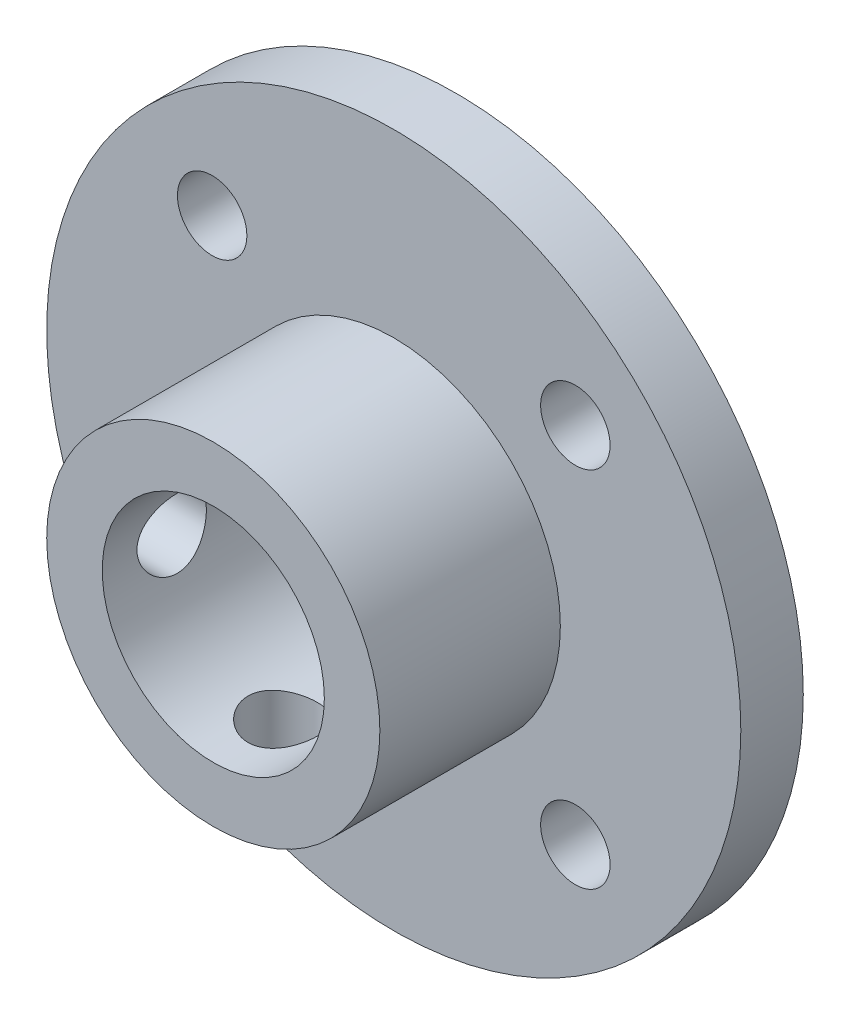
ISO-10303-21;
HEADER;
FILE_DESCRIPTION(('STEP AP214'),'2;1');
FILE_NAME('part.step','',(''),(''),'','','');
FILE_SCHEMA(('AUTOMOTIVE_DESIGN { 1 0 10303 214 1 1 1 1 }'));
ENDSEC;
DATA;
#1=APPLICATION_CONTEXT('core data for automotive mechanical design processes');
#2=APPLICATION_PROTOCOL_DEFINITION('international standard','automotive_design',2000,#1);
#3=PRODUCT_CONTEXT('',#1,'mechanical');
#4=PRODUCT('Part','Part','',(#3));
#5=PRODUCT_RELATED_PRODUCT_CATEGORY('part','',(#4));
#6=PRODUCT_DEFINITION_FORMATION('','',#4);
#7=PRODUCT_DEFINITION_CONTEXT('part definition',#1,'design');
#8=PRODUCT_DEFINITION('design','',#6,#7);
#9=PRODUCT_DEFINITION_SHAPE('','',#8);
#10=(LENGTH_UNIT() NAMED_UNIT(*) SI_UNIT(.MILLI.,.METRE.));
#11=(NAMED_UNIT(*) PLANE_ANGLE_UNIT() SI_UNIT($,.RADIAN.));
#12=(NAMED_UNIT(*) SI_UNIT($,.STERADIAN.) SOLID_ANGLE_UNIT());
#13=UNCERTAINTY_MEASURE_WITH_UNIT(LENGTH_MEASURE(1.E-05),#10,'distance_accuracy_value','');
#14=(GEOMETRIC_REPRESENTATION_CONTEXT(3) GLOBAL_UNCERTAINTY_ASSIGNED_CONTEXT((#13)) GLOBAL_UNIT_ASSIGNED_CONTEXT((#10,
#11,#12)) REPRESENTATION_CONTEXT('',''));
#15=CARTESIAN_POINT('',(0.,0.,0.));
#16=DIRECTION('',(0.,0.,1.));
#17=DIRECTION('',(1.,0.,0.));
#18=AXIS2_PLACEMENT_3D('',#15,#16,#17);
#19=CARTESIAN_POINT('',(0.,0.,4.5));
#20=DIRECTION('',(0.,0.,1.));
#21=DIRECTION('',(1.,0.,0.));
#22=AXIS2_PLACEMENT_3D('',#19,#20,#21);
#23=PLANE('',#22);
#24=CARTESIAN_POINT('',(-13.0814754519512,13.0814754519503,4.5));
#25=DIRECTION('',(0.,0.,1.));
#26=DIRECTION('',(1.,0.,0.));
#27=AXIS2_PLACEMENT_3D('',#24,#25,#26);
#28=CIRCLE('',#27,2.50000000000078);
#29=CARTESIAN_POINT('',(-10.5814754519504,13.0814754519503,4.5));
#30=VERTEX_POINT('',#29);
#31=EDGE_CURVE('E129',#30,#30,#28,.T.);
#32=ORIENTED_EDGE('',*,*,#31,.F.);
#33=EDGE_LOOP('',(#32));
#34=FACE_BOUND('',#33,.T.);
#35=CARTESIAN_POINT('',(13.0814754519519,-13.0814754519511,4.5));
#36=DIRECTION('',(0.,0.,1.));
#37=DIRECTION('',(1.,0.,0.));
#38=AXIS2_PLACEMENT_3D('',#35,#36,#37);
#39=CIRCLE('',#38,2.49999999999982);
#40=CARTESIAN_POINT('',(15.5814754519517,-13.0814754519511,4.5));
#41=VERTEX_POINT('',#40);
#42=EDGE_CURVE('E142',#41,#41,#39,.T.);
#43=ORIENTED_EDGE('',*,*,#42,.F.);
#44=EDGE_LOOP('',(#43));
#45=FACE_BOUND('',#44,.T.);
#46=CARTESIAN_POINT('',(0.,0.,4.5));
#47=DIRECTION('',(0.,0.,1.));
#48=DIRECTION('',(1.,0.,0.));
#49=AXIS2_PLACEMENT_3D('',#46,#47,#48);
#50=CIRCLE('',#49,25.);
#51=CARTESIAN_POINT('',(25.,0.,4.5));
#52=VERTEX_POINT('',#51);
#53=EDGE_CURVE('E10',#52,#52,#50,.T.);
#54=ORIENTED_EDGE('',*,*,#53,.T.);
#55=EDGE_LOOP('',(#54));
#56=FACE_BOUND('',#55,.T.);
#57=CARTESIAN_POINT('',(13.0814754519511,13.0814754519512,4.5));
#58=DIRECTION('',(0.,0.,1.));
#59=DIRECTION('',(1.,0.,0.));
#60=AXIS2_PLACEMENT_3D('',#57,#58,#59);
#61=CIRCLE('',#60,2.5);
#62=CARTESIAN_POINT('',(15.5814754519511,13.0814754519512,4.5));
#63=VERTEX_POINT('',#62);
#64=EDGE_CURVE('E146',#63,#63,#61,.T.);
#65=ORIENTED_EDGE('',*,*,#64,.F.);
#66=EDGE_LOOP('',(#65));
#67=FACE_BOUND('',#66,.T.);
#68=CARTESIAN_POINT('',(-13.0814754519503,-13.0814754519519,4.5));
#69=DIRECTION('',(0.,0.,1.));
#70=DIRECTION('',(1.,0.,0.));
#71=AXIS2_PLACEMENT_3D('',#68,#69,#70);
#72=CIRCLE('',#71,2.50000000000053);
#73=CARTESIAN_POINT('',(-10.5814754519498,-13.0814754519519,4.5));
#74=VERTEX_POINT('',#73);
#75=EDGE_CURVE('E138',#74,#74,#72,.T.);
#76=ORIENTED_EDGE('',*,*,#75,.F.);
#77=EDGE_LOOP('',(#76));
#78=FACE_BOUND('',#77,.T.);
#79=CARTESIAN_POINT('',(0.,0.,4.5));
#80=DIRECTION('',(0.,0.,1.));
#81=DIRECTION('',(1.,0.,0.));
#82=AXIS2_PLACEMENT_3D('',#79,#80,#81);
#83=CIRCLE('',#82,12.);
#84=CARTESIAN_POINT('',(12.,0.,4.5));
#85=VERTEX_POINT('',#84);
#86=EDGE_CURVE('E135',#85,#85,#83,.T.);
#87=ORIENTED_EDGE('',*,*,#86,.F.);
#88=EDGE_LOOP('',(#87));
#89=FACE_BOUND('',#88,.T.);
#90=ADVANCED_FACE('F35',(#34,#45,#56,#67,#78,#89),#23,.T.);
#91=CARTESIAN_POINT('',(0.,0.,0.));
#92=DIRECTION('',(0.,0.,1.));
#93=DIRECTION('',(1.,0.,0.));
#94=AXIS2_PLACEMENT_3D('',#91,#92,#93);
#95=PLANE('',#94);
#96=CARTESIAN_POINT('',(0.,0.,0.));
#97=DIRECTION('',(0.,0.,1.));
#98=DIRECTION('',(1.,0.,0.));
#99=AXIS2_PLACEMENT_3D('',#96,#97,#98);
#100=CIRCLE('',#99,25.);
#101=CARTESIAN_POINT('',(25.,0.,0.));
#102=VERTEX_POINT('',#101);
#103=EDGE_CURVE('E48',#102,#102,#100,.T.);
#104=ORIENTED_EDGE('',*,*,#103,.F.);
#105=EDGE_LOOP('',(#104));
#106=FACE_BOUND('',#105,.T.);
#107=CARTESIAN_POINT('',(0.,0.,0.));
#108=DIRECTION('',(0.,0.,1.));
#109=DIRECTION('',(1.,0.,0.));
#110=AXIS2_PLACEMENT_3D('',#107,#108,#109);
#111=CIRCLE('',#110,8.);
#112=CARTESIAN_POINT('',(8.,0.,0.));
#113=VERTEX_POINT('',#112);
#114=EDGE_CURVE('E53',#113,#113,#111,.T.);
#115=ORIENTED_EDGE('',*,*,#114,.T.);
#116=EDGE_LOOP('',(#115));
#117=FACE_BOUND('',#116,.T.);
#118=CARTESIAN_POINT('',(13.0814754519511,13.0814754519512,0.));
#119=DIRECTION('',(0.,0.,1.));
#120=DIRECTION('',(1.,0.,0.));
#121=AXIS2_PLACEMENT_3D('',#118,#119,#120);
#122=CIRCLE('',#121,2.5);
#123=CARTESIAN_POINT('',(15.5814754519511,13.0814754519512,0.));
#124=VERTEX_POINT('',#123);
#125=EDGE_CURVE('E116',#124,#124,#122,.T.);
#126=ORIENTED_EDGE('',*,*,#125,.T.);
#127=EDGE_LOOP('',(#126));
#128=FACE_BOUND('',#127,.T.);
#129=CARTESIAN_POINT('',(13.0814754519519,-13.0814754519511,0.));
#130=DIRECTION('',(0.,0.,1.));
#131=DIRECTION('',(1.,0.,0.));
#132=AXIS2_PLACEMENT_3D('',#129,#130,#131);
#133=CIRCLE('',#132,2.49999999999982);
#134=CARTESIAN_POINT('',(15.5814754519517,-13.0814754519511,0.));
#135=VERTEX_POINT('',#134);
#136=EDGE_CURVE('E120',#135,#135,#133,.T.);
#137=ORIENTED_EDGE('',*,*,#136,.T.);
#138=EDGE_LOOP('',(#137));
#139=FACE_BOUND('',#138,.T.);
#140=CARTESIAN_POINT('',(-13.0814754519503,-13.0814754519519,0.));
#141=DIRECTION('',(0.,0.,1.));
#142=DIRECTION('',(1.,0.,0.));
#143=AXIS2_PLACEMENT_3D('',#140,#141,#142);
#144=CIRCLE('',#143,2.50000000000053);
#145=CARTESIAN_POINT('',(-10.5814754519498,-13.0814754519519,0.));
#146=VERTEX_POINT('',#145);
#147=EDGE_CURVE('E124',#146,#146,#144,.T.);
#148=ORIENTED_EDGE('',*,*,#147,.T.);
#149=EDGE_LOOP('',(#148));
#150=FACE_BOUND('',#149,.T.);
#151=CARTESIAN_POINT('',(-13.0814754519512,13.0814754519503,0.));
#152=DIRECTION('',(0.,0.,1.));
#153=DIRECTION('',(1.,0.,0.));
#154=AXIS2_PLACEMENT_3D('',#151,#152,#153);
#155=CIRCLE('',#154,2.50000000000078);
#156=CARTESIAN_POINT('',(-10.5814754519504,13.0814754519503,0.));
#157=VERTEX_POINT('',#156);
#158=EDGE_CURVE('E127',#157,#157,#155,.T.);
#159=ORIENTED_EDGE('',*,*,#158,.T.);
#160=EDGE_LOOP('',(#159));
#161=FACE_BOUND('',#160,.T.);
#162=ADVANCED_FACE('F100',(#106,#117,#128,#139,#150,#161),#95,.F.);
#163=CARTESIAN_POINT('',(0.,0.,4.5));
#164=DIRECTION('',(0.,0.,-1.));
#165=DIRECTION('',(-1.,0.,0.));
#166=AXIS2_PLACEMENT_3D('',#163,#164,#165);
#167=CYLINDRICAL_SURFACE('',#166,25.);
#168=ORIENTED_EDGE('',*,*,#53,.F.);
#169=EDGE_LOOP('',(#168));
#170=FACE_BOUND('',#169,.T.);
#171=ORIENTED_EDGE('',*,*,#103,.T.);
#172=EDGE_LOOP('',(#171));
#173=FACE_BOUND('',#172,.T.);
#174=ADVANCED_FACE('F37',(#170,#173),#167,.T.);
#175=CARTESIAN_POINT('',(0.,0.,4.5));
#176=DIRECTION('',(0.,0.,-1.));
#177=DIRECTION('',(-1.,0.,0.));
#178=AXIS2_PLACEMENT_3D('',#175,#176,#177);
#179=CYLINDRICAL_SURFACE('',#178,8.);
#180=CARTESIAN_POINT('',(-8.,0.,15.));
#181=CARTESIAN_POINT('',(-7.9999993175598,-0.136878370349093,14.9999991068249));
#182=CARTESIAN_POINT('',(-7.99645389969682,-0.273766105005718,14.9887215461111));
#183=CARTESIAN_POINT('',(-7.98265788177613,-0.543538419176896,14.9440275169215));
#184=CARTESIAN_POINT('',(-7.97240576399719,-0.676422085451814,14.9106060372713));
#185=CARTESIAN_POINT('',(-7.94631631395819,-0.934257087301613,14.8228612576085));
#186=CARTESIAN_POINT('',(-7.9304876299805,-1.05922035397161,14.7685703106941));
#187=CARTESIAN_POINT('',(-7.89487938322185,-1.29826960469292,14.6407653646433));
#188=CARTESIAN_POINT('',(-7.8750991979981,-1.41235387088977,14.5672483364388));
#189=CARTESIAN_POINT('',(-7.83300427480565,-1.62993066990456,14.4006880159653));
#190=CARTESIAN_POINT('',(-7.81063431853978,-1.73304005631332,14.3071582298779));
#191=CARTESIAN_POINT('',(-7.76620092748417,-1.92239476407399,14.1042632151729));
#192=CARTESIAN_POINT('',(-7.74413755046914,-2.00863694579739,13.9948950450109));
#193=CARTESIAN_POINT('',(-7.70222289396344,-2.16388672966227,13.7601108723838));
#194=CARTESIAN_POINT('',(-7.68243976603591,-2.23241568300258,13.6343650449456));
#195=CARTESIAN_POINT('',(-7.64815603598468,-2.34719482153343,13.3724153700363));
#196=CARTESIAN_POINT('',(-7.63365404257377,-2.39345087543889,13.2362142884121));
#197=CARTESIAN_POINT('',(-7.61215213969001,-2.46096919860067,12.9615438450959));
#198=CARTESIAN_POINT('',(-7.60493945859016,-2.4829422001573,12.8232663127223));
#199=CARTESIAN_POINT('',(-7.598201102819,-2.50349110073976,12.5448137621762));
#200=CARTESIAN_POINT('',(-7.59867338454668,-2.50207321991544,12.4046392583567));
#201=CARTESIAN_POINT('',(-7.60706378150876,-2.47643649465479,12.132251079462));
#202=CARTESIAN_POINT('',(-7.61468683491897,-2.45312115738766,11.9999417482769));
#203=CARTESIAN_POINT('',(-7.63604051304978,-2.38581626711252,11.7412156869253));
#204=CARTESIAN_POINT('',(-7.64977178686229,-2.34182451689101,11.6147995845824));
#205=CARTESIAN_POINT('',(-7.68202088028593,-2.23377749362555,11.3692961111347));
#206=CARTESIAN_POINT('',(-7.70060569321649,-2.16943851324164,11.250342778616));
#207=CARTESIAN_POINT('',(-7.7404371316014,-2.02272041475697,11.0246244642418));
#208=CARTESIAN_POINT('',(-7.76168444789102,-1.94033661043155,10.9178626594926));
#209=CARTESIAN_POINT('',(-7.80563055600986,-1.75543390836425,10.714450113166));
#210=CARTESIAN_POINT('',(-7.82835139211391,-1.65216914118564,10.6184808844406));
#211=CARTESIAN_POINT('',(-7.8718314151916,-1.43072881619107,10.4450562128406));
#212=CARTESIAN_POINT('',(-7.89259045676745,-1.31255215469805,10.3676021415616));
#213=CARTESIAN_POINT('',(-7.93002589780382,-1.06332922093091,10.2329446227975));
#214=CARTESIAN_POINT('',(-7.94666921296415,-0.932189813838563,10.1759037290721));
#215=CARTESIAN_POINT('',(-7.97375911657108,-0.661535955565293,10.0848939982969));
#216=CARTESIAN_POINT('',(-7.98420758650304,-0.522024061449221,10.0509181555232));
#217=CARTESIAN_POINT('',(-7.99742778790027,-0.244370314580695,10.008163914842));
#218=CARTESIAN_POINT('',(-8.00048045790873,-0.106383697577692,9.99846291281295));
#219=CARTESIAN_POINT('',(-7.99939599461967,0.169260611465166,10.0019324532747));
#220=CARTESIAN_POINT('',(-7.9952599116227,0.306918348613012,10.0150996546452));
#221=CARTESIAN_POINT('',(-7.98044727539523,0.574438665951692,10.0631911852128));
#222=CARTESIAN_POINT('',(-7.96993586221374,0.704409956841867,10.097566535225));
#223=CARTESIAN_POINT('',(-7.94360242758579,0.956703857722748,10.1864287047334));
#224=CARTESIAN_POINT('',(-7.92777975028688,1.07902552089811,10.24091800805));
#225=CARTESIAN_POINT('',(-7.89197085518848,1.31586481334437,10.3699464330974));
#226=CARTESIAN_POINT('',(-7.87189253635336,1.43011947957558,10.4449419749936));
#227=CARTESIAN_POINT('',(-7.82986820006859,1.64473170192051,10.6123064202348));
#228=CARTESIAN_POINT('',(-7.80792167695775,1.74508547608789,10.7046800354893));
#229=CARTESIAN_POINT('',(-7.76353989766283,1.93317492583803,10.9085177801042));
#230=CARTESIAN_POINT('',(-7.74111973412883,2.02025304679062,11.0205933274784));
#231=CARTESIAN_POINT('',(-7.69923894191212,2.17442500490302,11.2582532327535));
#232=CARTESIAN_POINT('',(-7.67977826622621,2.24151915946859,11.383837376054));
#233=CARTESIAN_POINT('',(-7.64623564661738,2.35340166961084,11.644690345741));
#234=CARTESIAN_POINT('',(-7.63213292713749,2.39827639112025,11.7799192988714));
#235=CARTESIAN_POINT('',(-7.6110234168862,2.4644578863618,12.0565449864972));
#236=CARTESIAN_POINT('',(-7.60401392602456,2.48577362827989,12.1979393526871));
#237=CARTESIAN_POINT('',(-7.59816585427753,2.50358812316251,12.4760081751609));
#238=CARTESIAN_POINT('',(-7.59897209200284,2.50116559243271,12.6126069076948));
#239=CARTESIAN_POINT('',(-7.60780180751807,2.47417636257668,12.8833491698839));
#240=CARTESIAN_POINT('',(-7.61582494863208,2.44961069645024,13.0174928137735));
#241=CARTESIAN_POINT('',(-7.6379362836678,2.37975459827235,13.2775880791838));
#242=CARTESIAN_POINT('',(-7.65193396380513,2.33477284812016,13.4036308821867));
#243=CARTESIAN_POINT('',(-7.68439408509128,2.22560454669999,13.646480827068));
#244=CARTESIAN_POINT('',(-7.70285743429343,2.16141408888473,13.7632860841568));
#245=CARTESIAN_POINT('',(-7.74306974067005,2.01271350026986,13.9892919408796));
#246=CARTESIAN_POINT('',(-7.76491897845913,1.92750667048265,14.0980162590005));
#247=CARTESIAN_POINT('',(-7.8089799764242,1.7404179928096,14.299972656224));
#248=CARTESIAN_POINT('',(-7.83119183213309,1.63853168468878,14.3932005779821));
#249=CARTESIAN_POINT('',(-7.87434543904947,1.41697332564669,14.5645650767259));
#250=CARTESIAN_POINT('',(-7.89522203461346,1.29682914897477,14.6421094728999));
#251=CARTESIAN_POINT('',(-7.93253538593756,1.0445582760273,14.7757978302789));
#252=CARTESIAN_POINT('',(-7.94897388631644,0.912436315590897,14.8319502042837));
#253=CARTESIAN_POINT('',(-7.97441301466941,0.651495270747956,14.9171827352169));
#254=CARTESIAN_POINT('',(-7.98392481612283,0.523340674225092,14.9481497346107));
#255=CARTESIAN_POINT('',(-7.99671800680967,0.263459790880495,14.9895567199354));
#256=CARTESIAN_POINT('',(-8.00000065679286,0.131734232279349,15.000000859608));
#257=CARTESIAN_POINT('',(-8.,0.,15.));
#258=B_SPLINE_CURVE_WITH_KNOTS('',3,(#180,#181,#182,#183,#184,#185,#186,#187,#188,#189,#190,
#191,#192,#193,#194,#195,#196,#197,#198,#199,#200,#201,#202,#203,#204,#205,#206,#207,#208,#209,
#210,#211,#212,#213,#214,#215,#216,#217,#218,#219,#220,#221,#222,#223,#224,#225,#226,#227,#228,
#229,#230,#231,#232,#233,#234,#235,#236,#237,#238,#239,#240,#241,#242,#243,#244,#245,#246,#247,
#248,#249,#250,#251,#252,#253,#254,#255,#256,#257),.UNSPECIFIED.,.T.,.F.,(4,2,2,2,2,2,2,2,2,2,2,
2,2,2,2,2,2,2,2,2,2,2,2,2,2,2,2,2,2,2,2,2,2,2,2,2,2,2,4),(0.,0.41015089886502,0.820394646698132,
1.23000495840487,1.63967984311678,2.06075644390317,2.48191134862552,2.91347542494988,
3.34492572559054,3.76338300334419,4.18172900590276,4.58353834844338,4.98539039958126,
5.3931128544109,5.80094132020717,6.227334945592,6.65376014826606,7.0835092137954,
7.51312768989108,7.92615137096475,8.33911471298726,8.74181253445744,9.14456010069,
9.55712649476686,9.96980491418519,10.3988355742628,10.8278594196742,11.2552023150671,
11.6823824779468,12.0902440696666,12.4980866352126,12.8999582681244,13.3019116867944,
13.7195902803182,14.1373807476578,14.5688133627192,15.0000761335177,15.3948927332218,
15.7896294154519),.UNSPECIFIED.);
#259=CARTESIAN_POINT('',(-8.,0.,15.));
#260=VERTEX_POINT('',#259);
#261=EDGE_CURVE('E64',#260,#260,#258,.T.);
#262=ORIENTED_EDGE('',*,*,#261,.F.);
#263=EDGE_LOOP('',(#262));
#264=FACE_BOUND('',#263,.T.);
#265=CARTESIAN_POINT('',(0.,-8.,15.));
#266=CARTESIAN_POINT('',(0.136878370349094,-7.9999993175598,14.9999991068248));
#267=CARTESIAN_POINT('',(0.273766105005719,-7.99645389969682,14.9887215461111));
#268=CARTESIAN_POINT('',(0.543538419176897,-7.98265788177613,14.9440275169215));
#269=CARTESIAN_POINT('',(0.676422085451815,-7.97240576399719,14.9106060372713));
#270=CARTESIAN_POINT('',(0.934257087301614,-7.94631631395819,14.8228612576085));
#271=CARTESIAN_POINT('',(1.05922035397161,-7.9304876299805,14.7685703106941));
#272=CARTESIAN_POINT('',(1.29826960469292,-7.89487938322185,14.6407653646433));
#273=CARTESIAN_POINT('',(1.41235387088977,-7.8750991979981,14.5672483364388));
#274=CARTESIAN_POINT('',(1.62993066990456,-7.83300427480565,14.4006880159653));
#275=CARTESIAN_POINT('',(1.73304005631332,-7.81063431853978,14.3071582298779));
#276=CARTESIAN_POINT('',(1.92239476407399,-7.76620092748417,14.1042632151729));
#277=CARTESIAN_POINT('',(2.00863694579739,-7.74413755046914,13.9948950450109));
#278=CARTESIAN_POINT('',(2.16388672966227,-7.70222289396344,13.7601108723838));
#279=CARTESIAN_POINT('',(2.23241568300258,-7.68243976603591,13.6343650449456));
#280=CARTESIAN_POINT('',(2.34719482153343,-7.64815603598469,13.3724153700363));
#281=CARTESIAN_POINT('',(2.39345087543889,-7.63365404257377,13.2362142884121));
#282=CARTESIAN_POINT('',(2.46096919860067,-7.61215213969001,12.9615438450959));
#283=CARTESIAN_POINT('',(2.4829422001573,-7.60493945859016,12.8232663127223));
#284=CARTESIAN_POINT('',(2.50349110073976,-7.598201102819,12.5448137621762));
#285=CARTESIAN_POINT('',(2.50207321991544,-7.59867338454668,12.4046392583567));
#286=CARTESIAN_POINT('',(2.47643649465479,-7.60706378150876,12.132251079462));
#287=CARTESIAN_POINT('',(2.45312115738766,-7.61468683491897,11.9999417482769));
#288=CARTESIAN_POINT('',(2.38581626711252,-7.63604051304978,11.7412156869253));
#289=CARTESIAN_POINT('',(2.34182451689101,-7.6497717868623,11.6147995845824));
#290=CARTESIAN_POINT('',(2.23377749362555,-7.68202088028593,11.3692961111347));
#291=CARTESIAN_POINT('',(2.16943851324164,-7.70060569321649,11.250342778616));
#292=CARTESIAN_POINT('',(2.02272041475696,-7.7404371316014,11.0246244642418));
#293=CARTESIAN_POINT('',(1.94033661043155,-7.76168444789102,10.9178626594926));
#294=CARTESIAN_POINT('',(1.75543390836425,-7.80563055600986,10.714450113166));
#295=CARTESIAN_POINT('',(1.65216914118563,-7.82835139211391,10.6184808844406));
#296=CARTESIAN_POINT('',(1.43072881619106,-7.8718314151916,10.4450562128406));
#297=CARTESIAN_POINT('',(1.31255215469804,-7.89259045676745,10.3676021415616));
#298=CARTESIAN_POINT('',(1.06332922093091,-7.93002589780382,10.2329446227974));
#299=CARTESIAN_POINT('',(0.932189813838561,-7.94666921296415,10.1759037290721));
#300=CARTESIAN_POINT('',(0.66153595556529,-7.97375911657108,10.0848939982969));
#301=CARTESIAN_POINT('',(0.522024061449218,-7.98420758650304,10.0509181555232));
#302=CARTESIAN_POINT('',(0.244370314580691,-7.99742778790027,10.008163914842));
#303=CARTESIAN_POINT('',(0.106383697577688,-8.00048045790873,9.99846291281295));
#304=CARTESIAN_POINT('',(-0.16926061146517,-7.99939599461967,10.0019324532747));
#305=CARTESIAN_POINT('',(-0.306918348613016,-7.9952599116227,10.0150996546452));
#306=CARTESIAN_POINT('',(-0.574438665951696,-7.98044727539523,10.0631911852128));
#307=CARTESIAN_POINT('',(-0.704409956841871,-7.96993586221374,10.097566535225));
#308=CARTESIAN_POINT('',(-0.956703857722752,-7.94360242758579,10.1864287047334));
#309=CARTESIAN_POINT('',(-1.07902552089812,-7.92777975028687,10.24091800805));
#310=CARTESIAN_POINT('',(-1.31586481334437,-7.89197085518848,10.3699464330974));
#311=CARTESIAN_POINT('',(-1.43011947957558,-7.87189253635335,10.4449419749936));
#312=CARTESIAN_POINT('',(-1.64473170192052,-7.82986820006859,10.6123064202348));
#313=CARTESIAN_POINT('',(-1.7450854760879,-7.80792167695774,10.7046800354893));
#314=CARTESIAN_POINT('',(-1.93317492583804,-7.76353989766283,10.9085177801042));
#315=CARTESIAN_POINT('',(-2.02025304679062,-7.74111973412883,11.0205933274784));
#316=CARTESIAN_POINT('',(-2.17442500490303,-7.69923894191212,11.2582532327535));
#317=CARTESIAN_POINT('',(-2.24151915946859,-7.67977826622621,11.383837376054));
#318=CARTESIAN_POINT('',(-2.35340166961084,-7.64623564661738,11.644690345741));
#319=CARTESIAN_POINT('',(-2.39827639112025,-7.63213292713749,11.7799192988714));
#320=CARTESIAN_POINT('',(-2.4644578863618,-7.6110234168862,12.0565449864972));
#321=CARTESIAN_POINT('',(-2.48577362827989,-7.60401392602456,12.1979393526871));
#322=CARTESIAN_POINT('',(-2.50358812316251,-7.59816585427753,12.4760081751609));
#323=CARTESIAN_POINT('',(-2.50116559243271,-7.59897209200284,12.6126069076948));
#324=CARTESIAN_POINT('',(-2.47417636257668,-7.60780180751807,12.8833491698839));
#325=CARTESIAN_POINT('',(-2.44961069645024,-7.61582494863208,13.0174928137735));
#326=CARTESIAN_POINT('',(-2.37975459827235,-7.6379362836678,13.2775880791838));
#327=CARTESIAN_POINT('',(-2.33477284812017,-7.65193396380514,13.4036308821867));
#328=CARTESIAN_POINT('',(-2.22560454669999,-7.68439408509128,13.646480827068));
#329=CARTESIAN_POINT('',(-2.16141408888474,-7.70285743429343,13.7632860841568));
#330=CARTESIAN_POINT('',(-2.01271350026987,-7.74306974067005,13.9892919408796));
#331=CARTESIAN_POINT('',(-1.92750667048265,-7.76491897845913,14.0980162590005));
#332=CARTESIAN_POINT('',(-1.7404179928096,-7.8089799764242,14.299972656224));
#333=CARTESIAN_POINT('',(-1.63853168468878,-7.83119183213309,14.3932005779821));
#334=CARTESIAN_POINT('',(-1.41697332564669,-7.87434543904947,14.5645650767259));
#335=CARTESIAN_POINT('',(-1.29682914897477,-7.89522203461345,14.6421094728999));
#336=CARTESIAN_POINT('',(-1.0445582760273,-7.93253538593756,14.7757978302789));
#337=CARTESIAN_POINT('',(-0.912436315590897,-7.94897388631644,14.8319502042837));
#338=CARTESIAN_POINT('',(-0.651495270747957,-7.97441301466941,14.9171827352169));
#339=CARTESIAN_POINT('',(-0.523340674225092,-7.98392481612283,14.9481497346107));
#340=CARTESIAN_POINT('',(-0.263459790880494,-7.99671800680967,14.9895567199354));
#341=CARTESIAN_POINT('',(-0.131734232279348,-8.00000065679286,15.000000859608));
#342=CARTESIAN_POINT('',(0.,-8.,15.));
#343=B_SPLINE_CURVE_WITH_KNOTS('',3,(#265,#266,#267,#268,#269,#270,#271,#272,#273,#274,#275,
#276,#277,#278,#279,#280,#281,#282,#283,#284,#285,#286,#287,#288,#289,#290,#291,#292,#293,#294,
#295,#296,#297,#298,#299,#300,#301,#302,#303,#304,#305,#306,#307,#308,#309,#310,#311,#312,#313,
#314,#315,#316,#317,#318,#319,#320,#321,#322,#323,#324,#325,#326,#327,#328,#329,#330,#331,#332,
#333,#334,#335,#336,#337,#338,#339,#340,#341,#342),.UNSPECIFIED.,.T.,.F.,(4,2,2,2,2,2,2,2,2,2,2,
2,2,2,2,2,2,2,2,2,2,2,2,2,2,2,2,2,2,2,2,2,2,2,2,2,2,2,4),(0.,0.41015089886502,0.820394646698132,
1.23000495840487,1.63967984311678,2.06075644390316,2.48191134862552,2.91347542494988,
3.34492572559054,3.7633830033442,4.18172900590276,4.58353834844338,4.98539039958126,
5.39311285441091,5.80094132020717,6.22733494559201,6.65376014826607,7.08350921379541,
7.51312768989108,7.92615137096475,8.33911471298726,8.74181253445744,9.14456010069,
9.55712649476687,9.96980491418519,10.3988355742628,10.8278594196742,11.2552023150671,
11.6823824779468,12.0902440696666,12.4980866352126,12.8999582681244,13.3019116867944,
13.7195902803182,14.1373807476578,14.5688133627192,15.0000761335177,15.3948927332218,
15.7896294154519),.UNSPECIFIED.);
#344=CARTESIAN_POINT('',(0.,-8.,15.));
#345=VERTEX_POINT('',#344);
#346=EDGE_CURVE('E63',#345,#345,#343,.T.);
#347=ORIENTED_EDGE('',*,*,#346,.F.);
#348=EDGE_LOOP('',(#347));
#349=FACE_BOUND('',#348,.T.);
#350=ORIENTED_EDGE('',*,*,#114,.F.);
#351=EDGE_LOOP('',(#350));
#352=FACE_BOUND('',#351,.T.);
#353=CARTESIAN_POINT('',(0.,0.,17.5));
#354=DIRECTION('',(0.,0.,1.));
#355=DIRECTION('',(1.,0.,0.));
#356=AXIS2_PLACEMENT_3D('',#353,#354,#355);
#357=CIRCLE('',#356,8.);
#358=CARTESIAN_POINT('',(8.,0.,17.5));
#359=VERTEX_POINT('',#358);
#360=EDGE_CURVE('E85',#359,#359,#357,.T.);
#361=ORIENTED_EDGE('',*,*,#360,.T.);
#362=EDGE_LOOP('',(#361));
#363=FACE_BOUND('',#362,.T.);
#364=ADVANCED_FACE('F90',(#264,#349,#352,#363),#179,.F.);
#365=CARTESIAN_POINT('',(13.0814754519511,13.0814754519512,4.5));
#366=DIRECTION('',(0.,0.,-1.));
#367=DIRECTION('',(-1.,0.,0.));
#368=AXIS2_PLACEMENT_3D('',#365,#366,#367);
#369=CYLINDRICAL_SURFACE('',#368,2.5);
#370=ORIENTED_EDGE('',*,*,#64,.T.);
#371=EDGE_LOOP('',(#370));
#372=FACE_BOUND('',#371,.T.);
#373=ORIENTED_EDGE('',*,*,#125,.F.);
#374=EDGE_LOOP('',(#373));
#375=FACE_BOUND('',#374,.T.);
#376=ADVANCED_FACE('F95',(#372,#375),#369,.F.);
#377=CARTESIAN_POINT('',(13.0814754519519,-13.0814754519511,4.5));
#378=DIRECTION('',(0.,0.,-1.));
#379=DIRECTION('',(-1.,0.,0.));
#380=AXIS2_PLACEMENT_3D('',#377,#378,#379);
#381=CYLINDRICAL_SURFACE('',#380,2.49999999999982);
#382=ORIENTED_EDGE('',*,*,#42,.T.);
#383=EDGE_LOOP('',(#382));
#384=FACE_BOUND('',#383,.T.);
#385=ORIENTED_EDGE('',*,*,#136,.F.);
#386=EDGE_LOOP('',(#385));
#387=FACE_BOUND('',#386,.T.);
#388=ADVANCED_FACE('F177',(#384,#387),#381,.F.);
#389=CARTESIAN_POINT('',(-13.0814754519503,-13.0814754519519,4.5));
#390=DIRECTION('',(0.,0.,-1.));
#391=DIRECTION('',(-1.,0.,0.));
#392=AXIS2_PLACEMENT_3D('',#389,#390,#391);
#393=CYLINDRICAL_SURFACE('',#392,2.50000000000053);
#394=ORIENTED_EDGE('',*,*,#75,.T.);
#395=EDGE_LOOP('',(#394));
#396=FACE_BOUND('',#395,.T.);
#397=ORIENTED_EDGE('',*,*,#147,.F.);
#398=EDGE_LOOP('',(#397));
#399=FACE_BOUND('',#398,.T.);
#400=ADVANCED_FACE('F170',(#396,#399),#393,.F.);
#401=CARTESIAN_POINT('',(-13.0814754519512,13.0814754519503,4.5));
#402=DIRECTION('',(0.,0.,-1.));
#403=DIRECTION('',(-1.,0.,0.));
#404=AXIS2_PLACEMENT_3D('',#401,#402,#403);
#405=CYLINDRICAL_SURFACE('',#404,2.50000000000078);
#406=ORIENTED_EDGE('',*,*,#31,.T.);
#407=EDGE_LOOP('',(#406));
#408=FACE_BOUND('',#407,.T.);
#409=ORIENTED_EDGE('',*,*,#158,.F.);
#410=EDGE_LOOP('',(#409));
#411=FACE_BOUND('',#410,.T.);
#412=ADVANCED_FACE('F163',(#408,#411),#405,.F.);
#413=CARTESIAN_POINT('',(0.,0.,17.5));
#414=DIRECTION('',(0.,0.,1.));
#415=DIRECTION('',(1.,0.,0.));
#416=AXIS2_PLACEMENT_3D('',#413,#414,#415);
#417=PLANE('',#416);
#418=CARTESIAN_POINT('',(0.,0.,17.5));
#419=DIRECTION('',(0.,0.,1.));
#420=DIRECTION('',(1.,0.,0.));
#421=AXIS2_PLACEMENT_3D('',#418,#419,#420);
#422=CIRCLE('',#421,12.);
#423=CARTESIAN_POINT('',(12.,0.,17.5));
#424=VERTEX_POINT('',#423);
#425=EDGE_CURVE('E130',#424,#424,#422,.T.);
#426=ORIENTED_EDGE('',*,*,#425,.T.);
#427=EDGE_LOOP('',(#426));
#428=FACE_BOUND('',#427,.T.);
#429=ORIENTED_EDGE('',*,*,#360,.F.);
#430=EDGE_LOOP('',(#429));
#431=FACE_BOUND('',#430,.T.);
#432=ADVANCED_FACE('F75',(#428,#431),#417,.T.);
#433=CARTESIAN_POINT('',(0.,0.,17.5));
#434=DIRECTION('',(0.,0.,-1.));
#435=DIRECTION('',(-1.,0.,0.));
#436=AXIS2_PLACEMENT_3D('',#433,#434,#435);
#437=CYLINDRICAL_SURFACE('',#436,12.);
#438=CARTESIAN_POINT('',(-12.,0.,15.));
#439=CARTESIAN_POINT('',(-11.999997430533,-0.138818083403321,14.9999950450616));
#440=CARTESIAN_POINT('',(-11.9975665755009,-0.277697579041751,14.9883986685625));
#441=CARTESIAN_POINT('',(-11.9881040198136,-0.551522632533987,14.9423613009343));
#442=CARTESIAN_POINT('',(-11.981068823785,-0.686465120256626,14.9079029539261));
#443=CARTESIAN_POINT('',(-11.963182183924,-0.948418264582685,14.8172590901564));
#444=CARTESIAN_POINT('',(-11.9523345410529,-1.07543667341837,14.7610952080022));
#445=CARTESIAN_POINT('',(-11.9279985561972,-1.31824065721192,14.6287007822876));
#446=CARTESIAN_POINT('',(-11.9145103325195,-1.43402673506865,14.5524711376883));
#447=CARTESIAN_POINT('',(-11.886154000493,-1.65278064861767,14.3809273196187));
#448=CARTESIAN_POINT('',(-11.8712701169706,-1.75556048832537,14.2853759975298));
#449=CARTESIAN_POINT('',(-11.841913153849,-1.94375555353879,14.0784106816098));
#450=CARTESIAN_POINT('',(-11.8274401083337,-2.02916934192198,13.9669953762555));
#451=CARTESIAN_POINT('',(-11.8003888519062,-2.18102063354434,13.7300960624677));
#452=CARTESIAN_POINT('',(-11.7878309034966,-2.24726109361302,13.6044832309945));
#453=CARTESIAN_POINT('',(-11.7662568130004,-2.35762238696128,13.3436050964545));
#454=CARTESIAN_POINT('',(-11.7572402893514,-2.40174560335283,13.2083408351149));
#455=CARTESIAN_POINT('',(-11.7439300197224,-2.46600480267474,12.9340295251687));
#456=CARTESIAN_POINT('',(-11.7395711371173,-2.48647195393598,12.7950632813305));
#457=CARTESIAN_POINT('',(-11.7358738143298,-2.5038671531123,12.5156063142747));
#458=CARTESIAN_POINT('',(-11.7365348160196,-2.50079781789374,12.3751157622694));
#459=CARTESIAN_POINT('',(-11.7427434863835,-2.47147438074395,12.0990379440497));
#460=CARTESIAN_POINT('',(-11.748210673598,-2.44560210465441,11.9634080406776));
#461=CARTESIAN_POINT('',(-11.7632887523188,-2.37201087059891,11.6984569807101));
#462=CARTESIAN_POINT('',(-11.7728998568263,-2.32429078962764,11.5691361487873));
#463=CARTESIAN_POINT('',(-11.795263829282,-2.20800006427857,11.319385543168));
#464=CARTESIAN_POINT('',(-11.8080390757117,-2.13928005068474,11.1990274069459));
#465=CARTESIAN_POINT('',(-11.8352778002144,-1.98304539854964,10.9714085114637));
#466=CARTESIAN_POINT('',(-11.8497414879707,-1.89552842452518,10.864149382328));
#467=CARTESIAN_POINT('',(-11.8790746185982,-1.70214984309357,10.6635720778393));
#468=CARTESIAN_POINT('',(-11.8939464639895,-1.59596286682417,10.570567662206));
#469=CARTESIAN_POINT('',(-11.92216176286,-1.3693345772236,10.4036391155421));
#470=CARTESIAN_POINT('',(-11.9355051934047,-1.24889305005154,10.3297152708032));
#471=CARTESIAN_POINT('',(-11.9591974188563,-0.996811082470962,10.2029798369281));
#472=CARTESIAN_POINT('',(-11.9695407942052,-0.865150923853005,10.1502063908658));
#473=CARTESIAN_POINT('',(-11.9860267642256,-0.594569241944315,10.067616590329));
#474=CARTESIAN_POINT('',(-11.9921699119211,-0.455648677190184,10.0377972135372));
#475=CARTESIAN_POINT('',(-11.9994855043091,-0.177183731401675,10.0024114958642));
#476=CARTESIAN_POINT('',(-12.0007458707516,-0.0376961110523627,9.9964161170115));
#477=CARTESIAN_POINT('',(-11.9983990450555,0.240287597515423,10.0076898999382));
#478=CARTESIAN_POINT('',(-11.9947921509631,0.378783745924511,10.0249576372032));
#479=CARTESIAN_POINT('',(-11.9831712995837,0.649452734239622,10.0819113069391));
#480=CARTESIAN_POINT('',(-11.9752010573615,0.781674385788408,10.1213749707669));
#481=CARTESIAN_POINT('',(-11.9557445448479,1.03762289332266,10.2213557208428));
#482=CARTESIAN_POINT('',(-11.9442579948916,1.16134907267355,10.281874481732));
#483=CARTESIAN_POINT('',(-11.9188248298143,1.39858861388698,10.4231607564751));
#484=CARTESIAN_POINT('',(-11.9048478762466,1.51194643893966,10.5041838591381));
#485=CARTESIAN_POINT('',(-11.8760513659942,1.72361089177304,10.6838391261525));
#486=CARTESIAN_POINT('',(-11.8612317108502,1.82191575582657,10.7824733510379));
#487=CARTESIAN_POINT('',(-11.8321204906275,2.0023572973036,10.9965111539994));
#488=CARTESIAN_POINT('',(-11.81784178615,2.08419829200408,11.1121660639106));
#489=CARTESIAN_POINT('',(-11.7917120203161,2.22729438158487,11.3558325684276));
#490=CARTESIAN_POINT('',(-11.779860857893,2.28855033355728,11.4838436482782));
#491=CARTESIAN_POINT('',(-11.7600340141608,2.38834492887844,11.7479223925965));
#492=CARTESIAN_POINT('',(-11.7520374556937,2.42700619656063,11.8839420743317));
#493=CARTESIAN_POINT('',(-11.7407836941939,2.48088077046814,12.1607331009845));
#494=CARTESIAN_POINT('',(-11.7375258132073,2.49609743088882,12.3015037632389));
#495=CARTESIAN_POINT('',(-11.7361581461701,2.50251852975223,12.5808268019993));
#496=CARTESIAN_POINT('',(-11.73794804643,2.49419085245451,12.7193681404441));
#497=CARTESIAN_POINT('',(-11.7462489450986,2.45479810628063,12.9930280178404));
#498=CARTESIAN_POINT('',(-11.7527598981925,2.42373325564532,13.1281465896322));
#499=CARTESIAN_POINT('',(-11.7697226489543,2.3399643553717,13.3907955437813));
#500=CARTESIAN_POINT('',(-11.7801631401586,2.28732235136842,13.5183464929739));
#501=CARTESIAN_POINT('',(-11.8038141147748,2.16194914599514,13.7628775520533));
#502=CARTESIAN_POINT('',(-11.8170248553092,2.0892160796606,13.8798566792663));
#503=CARTESIAN_POINT('',(-11.8450315910229,1.92414739068482,14.1022432541589));
#504=CARTESIAN_POINT('',(-11.8598522773681,1.83147578083645,14.20739824913));
#505=CARTESIAN_POINT('',(-11.8892367916643,1.62984887623067,14.4008189864527));
#506=CARTESIAN_POINT('',(-11.9038005596976,1.52088983766594,14.489080835103));
#507=CARTESIAN_POINT('',(-11.9312288909527,1.28826885501541,14.6471771463681));
#508=CARTESIAN_POINT('',(-11.9440719214649,1.1644518430427,14.7167873597726));
#509=CARTESIAN_POINT('',(-11.9663981698818,0.906639687996908,14.83410045686));
#510=CARTESIAN_POINT('',(-11.975884323642,0.772653563814488,14.8818224943638));
#511=CARTESIAN_POINT('',(-11.9886499956289,0.53203058580021,14.9450805565768));
#512=CARTESIAN_POINT('',(-11.9928807132279,0.426735187455858,14.9656375264177));
#513=CARTESIAN_POINT('',(-11.9985566557952,0.214305348353074,14.9930989085547));
#514=CARTESIAN_POINT('',(-12.0000019836917,0.107170975697744,15.0000038253344));
#515=CARTESIAN_POINT('',(-12.,0.,15.));
#516=B_SPLINE_CURVE_WITH_KNOTS('',3,(#438,#439,#440,#441,#442,#443,#444,#445,#446,#447,#448,
#449,#450,#451,#452,#453,#454,#455,#456,#457,#458,#459,#460,#461,#462,#463,#464,#465,#466,#467,
#468,#469,#470,#471,#472,#473,#474,#475,#476,#477,#478,#479,#480,#481,#482,#483,#484,#485,#486,
#487,#488,#489,#490,#491,#492,#493,#494,#495,#496,#497,#498,#499,#500,#501,#502,#503,#504,#505,
#506,#507,#508,#509,#510,#511,#512,#513,#514,#515),.UNSPECIFIED.,.T.,.F.,(4,2,2,2,2,2,2,2,2,2,2,
2,2,2,2,2,2,2,2,2,2,2,2,2,2,2,2,2,2,2,2,2,2,2,2,2,2,2,4),(0.,0.416062090206367,0.83244039981245,
1.24840475765089,1.66435048314598,2.08575052776245,2.50718543103572,2.93280898357097,
3.35838666570981,3.77793150339709,4.19742969534329,4.61003424258119,5.0226600006056,
5.43829184833499,5.85397536736069,6.27779052710932,6.70161204556436,7.12619448999325,
7.55072102091543,7.96756678815351,8.38438703104555,8.79710573265244,9.20985726781867,
9.62803167991474,10.0462550512915,10.4714252765867,10.8965777970262,11.3194010019005,
11.7421637082837,12.1565844658208,12.5710012456272,12.9842346278651,13.3975063816296,
13.8183804966062,14.2393515023474,14.6651772879651,15.0906297292995,15.4118517695456,
15.7330619394678),.UNSPECIFIED.);
#517=CARTESIAN_POINT('',(-12.,0.,15.));
#518=VERTEX_POINT('',#517);
#519=EDGE_CURVE('E39',#518,#518,#516,.T.);
#520=ORIENTED_EDGE('',*,*,#519,.T.);
#521=EDGE_LOOP('',(#520));
#522=FACE_BOUND('',#521,.T.);
#523=CARTESIAN_POINT('',(0.,-12.,15.));
#524=CARTESIAN_POINT('',(0.138818083403322,-11.999997430533,14.9999950450616));
#525=CARTESIAN_POINT('',(0.277697579041752,-11.9975665755009,14.9883986685625));
#526=CARTESIAN_POINT('',(0.551522632533988,-11.9881040198136,14.9423613009343));
#527=CARTESIAN_POINT('',(0.686465120256627,-11.981068823785,14.9079029539261));
#528=CARTESIAN_POINT('',(0.948418264582685,-11.963182183924,14.8172590901564));
#529=CARTESIAN_POINT('',(1.07543667341837,-11.9523345410529,14.7610952080022));
#530=CARTESIAN_POINT('',(1.31824065721192,-11.9279985561972,14.6287007822876));
#531=CARTESIAN_POINT('',(1.43402673506865,-11.9145103325195,14.5524711376883));
#532=CARTESIAN_POINT('',(1.65278064861767,-11.886154000493,14.3809273196187));
#533=CARTESIAN_POINT('',(1.75556048832537,-11.8712701169706,14.2853759975298));
#534=CARTESIAN_POINT('',(1.94375555353879,-11.841913153849,14.0784106816098));
#535=CARTESIAN_POINT('',(2.02916934192198,-11.8274401083337,13.9669953762555));
#536=CARTESIAN_POINT('',(2.18102063354434,-11.8003888519062,13.7300960624677));
#537=CARTESIAN_POINT('',(2.24726109361302,-11.7878309034966,13.6044832309945));
#538=CARTESIAN_POINT('',(2.35762238696128,-11.7662568130004,13.3436050964545));
#539=CARTESIAN_POINT('',(2.40174560335283,-11.7572402893514,13.2083408351149));
#540=CARTESIAN_POINT('',(2.46600480267474,-11.7439300197225,12.9340295251687));
#541=CARTESIAN_POINT('',(2.48647195393598,-11.7395711371173,12.7950632813305));
#542=CARTESIAN_POINT('',(2.5038671531123,-11.7358738143298,12.5156063142747));
#543=CARTESIAN_POINT('',(2.50079781789374,-11.7365348160196,12.3751157622694));
#544=CARTESIAN_POINT('',(2.47147438074395,-11.7427434863835,12.0990379440497));
#545=CARTESIAN_POINT('',(2.44560210465441,-11.748210673598,11.9634080406776));
#546=CARTESIAN_POINT('',(2.37201087059891,-11.7632887523188,11.6984569807101));
#547=CARTESIAN_POINT('',(2.32429078962764,-11.7728998568263,11.5691361487873));
#548=CARTESIAN_POINT('',(2.20800006427857,-11.795263829282,11.319385543168));
#549=CARTESIAN_POINT('',(2.13928005068474,-11.8080390757117,11.1990274069459));
#550=CARTESIAN_POINT('',(1.98304539854964,-11.8352778002144,10.9714085114637));
#551=CARTESIAN_POINT('',(1.89552842452518,-11.8497414879707,10.864149382328));
#552=CARTESIAN_POINT('',(1.70214984309357,-11.8790746185982,10.6635720778393));
#553=CARTESIAN_POINT('',(1.59596286682417,-11.8939464639895,10.570567662206));
#554=CARTESIAN_POINT('',(1.3693345772236,-11.92216176286,10.4036391155421));
#555=CARTESIAN_POINT('',(1.24889305005153,-11.9355051934047,10.3297152708032));
#556=CARTESIAN_POINT('',(0.996811082470959,-11.9591974188563,10.2029798369281));
#557=CARTESIAN_POINT('',(0.865150923853001,-11.9695407942052,10.1502063908658));
#558=CARTESIAN_POINT('',(0.594569241944311,-11.9860267642256,10.067616590329));
#559=CARTESIAN_POINT('',(0.45564867719018,-11.9921699119211,10.0377972135372));
#560=CARTESIAN_POINT('',(0.177183731401671,-11.9994855043091,10.0024114958642));
#561=CARTESIAN_POINT('',(0.0376961110523582,-12.0007458707516,9.9964161170115));
#562=CARTESIAN_POINT('',(-0.240287597515428,-11.9983990450555,10.0076898999382));
#563=CARTESIAN_POINT('',(-0.378783745924515,-11.9947921509631,10.0249576372032));
#564=CARTESIAN_POINT('',(-0.649452734239625,-11.9831712995837,10.0819113069391));
#565=CARTESIAN_POINT('',(-0.781674385788411,-11.9752010573615,10.1213749707669));
#566=CARTESIAN_POINT('',(-1.03762289332266,-11.9557445448479,10.2213557208428));
#567=CARTESIAN_POINT('',(-1.16134907267355,-11.9442579948916,10.281874481732));
#568=CARTESIAN_POINT('',(-1.39858861388699,-11.9188248298143,10.4231607564751));
#569=CARTESIAN_POINT('',(-1.51194643893967,-11.9048478762466,10.5041838591381));
#570=CARTESIAN_POINT('',(-1.72361089177304,-11.8760513659942,10.6838391261525));
#571=CARTESIAN_POINT('',(-1.82191575582657,-11.8612317108502,10.7824733510379));
#572=CARTESIAN_POINT('',(-2.0023572973036,-11.8321204906275,10.9965111539994));
#573=CARTESIAN_POINT('',(-2.08419829200409,-11.81784178615,11.1121660639106));
#574=CARTESIAN_POINT('',(-2.22729438158487,-11.7917120203161,11.3558325684276));
#575=CARTESIAN_POINT('',(-2.28855033355728,-11.779860857893,11.4838436482782));
#576=CARTESIAN_POINT('',(-2.38834492887844,-11.7600340141608,11.7479223925965));
#577=CARTESIAN_POINT('',(-2.42700619656063,-11.7520374556937,11.8839420743317));
#578=CARTESIAN_POINT('',(-2.48088077046815,-11.7407836941939,12.1607331009845));
#579=CARTESIAN_POINT('',(-2.49609743088882,-11.7375258132073,12.3015037632389));
#580=CARTESIAN_POINT('',(-2.50251852975223,-11.7361581461701,12.5808268019993));
#581=CARTESIAN_POINT('',(-2.49419085245451,-11.73794804643,12.7193681404441));
#582=CARTESIAN_POINT('',(-2.45479810628063,-11.7462489450985,12.9930280178404));
#583=CARTESIAN_POINT('',(-2.42373325564532,-11.7527598981925,13.1281465896322));
#584=CARTESIAN_POINT('',(-2.3399643553717,-11.7697226489543,13.3907955437813));
#585=CARTESIAN_POINT('',(-2.28732235136843,-11.7801631401586,13.5183464929739));
#586=CARTESIAN_POINT('',(-2.16194914599515,-11.8038141147748,13.7628775520533));
#587=CARTESIAN_POINT('',(-2.0892160796606,-11.8170248553092,13.8798566792663));
#588=CARTESIAN_POINT('',(-1.92414739068482,-11.8450315910229,14.1022432541589));
#589=CARTESIAN_POINT('',(-1.83147578083645,-11.8598522773681,14.20739824913));
#590=CARTESIAN_POINT('',(-1.62984887623067,-11.8892367916643,14.4008189864527));
#591=CARTESIAN_POINT('',(-1.52088983766594,-11.9038005596976,14.489080835103));
#592=CARTESIAN_POINT('',(-1.28826885501541,-11.9312288909528,14.6471771463681));
#593=CARTESIAN_POINT('',(-1.1644518430427,-11.9440719214649,14.7167873597726));
#594=CARTESIAN_POINT('',(-0.906639687996908,-11.9663981698818,14.83410045686));
#595=CARTESIAN_POINT('',(-0.772653563814488,-11.975884323642,14.8818224943638));
#596=CARTESIAN_POINT('',(-0.532030585800211,-11.9886499956289,14.9450805565769));
#597=CARTESIAN_POINT('',(-0.426735187455859,-11.9928807132279,14.9656375264177));
#598=CARTESIAN_POINT('',(-0.214305348353074,-11.9985566557952,14.9930989085547));
#599=CARTESIAN_POINT('',(-0.107170975697743,-12.0000019836917,15.0000038253344));
#600=CARTESIAN_POINT('',(0.,-12.,15.));
#601=B_SPLINE_CURVE_WITH_KNOTS('',3,(#523,#524,#525,#526,#527,#528,#529,#530,#531,#532,#533,
#534,#535,#536,#537,#538,#539,#540,#541,#542,#543,#544,#545,#546,#547,#548,#549,#550,#551,#552,
#553,#554,#555,#556,#557,#558,#559,#560,#561,#562,#563,#564,#565,#566,#567,#568,#569,#570,#571,
#572,#573,#574,#575,#576,#577,#578,#579,#580,#581,#582,#583,#584,#585,#586,#587,#588,#589,#590,
#591,#592,#593,#594,#595,#596,#597,#598,#599,#600),.UNSPECIFIED.,.T.,.F.,(4,2,2,2,2,2,2,2,2,2,2,
2,2,2,2,2,2,2,2,2,2,2,2,2,2,2,2,2,2,2,2,2,2,2,2,2,2,2,4),(0.,0.416062090206367,0.83244039981245,
1.24840475765089,1.66435048314598,2.08575052776245,2.50718543103572,2.93280898357097,
3.35838666570981,3.77793150339709,4.19742969534329,4.61003424258119,5.0226600006056,
5.43829184833499,5.85397536736069,6.27779052710932,6.70161204556436,7.12619448999326,
7.55072102091543,7.96756678815352,8.38438703104556,8.79710573265244,9.20985726781867,
9.62803167991474,10.0462550512915,10.4714252765867,10.8965777970262,11.3194010019005,
11.7421637082837,12.1565844658208,12.5710012456272,12.9842346278651,13.3975063816296,
13.8183804966062,14.2393515023474,14.6651772879651,15.0906297292995,15.4118517695456,
15.7330619394678),.UNSPECIFIED.);
#602=CARTESIAN_POINT('',(0.,-12.,15.));
#603=VERTEX_POINT('',#602);
#604=EDGE_CURVE('E57',#603,#603,#601,.T.);
#605=ORIENTED_EDGE('',*,*,#604,.T.);
#606=EDGE_LOOP('',(#605));
#607=FACE_BOUND('',#606,.T.);
#608=ORIENTED_EDGE('',*,*,#425,.F.);
#609=EDGE_LOOP('',(#608));
#610=FACE_BOUND('',#609,.T.);
#611=ORIENTED_EDGE('',*,*,#86,.T.);
#612=EDGE_LOOP('',(#611));
#613=FACE_BOUND('',#612,.T.);
#614=ADVANCED_FACE('F65',(#522,#607,#610,#613),#437,.T.);
#615=CARTESIAN_POINT('',(0.,-26.,12.5));
#616=DIRECTION('',(0.,1.,0.));
#617=DIRECTION('',(0.,0.,1.));
#618=AXIS2_PLACEMENT_3D('',#615,#616,#617);
#619=CYLINDRICAL_SURFACE('',#618,2.5);
#620=ORIENTED_EDGE('',*,*,#346,.T.);
#621=EDGE_LOOP('',(#620));
#622=FACE_BOUND('',#621,.T.);
#623=ORIENTED_EDGE('',*,*,#604,.F.);
#624=EDGE_LOOP('',(#623));
#625=FACE_BOUND('',#624,.T.);
#626=ADVANCED_FACE('F69',(#622,#625),#619,.F.);
#627=CARTESIAN_POINT('',(-26.,0.,12.5));
#628=DIRECTION('',(1.,0.,0.));
#629=DIRECTION('',(0.,0.,-1.));
#630=AXIS2_PLACEMENT_3D('',#627,#628,#629);
#631=CYLINDRICAL_SURFACE('',#630,2.5);
#632=ORIENTED_EDGE('',*,*,#261,.T.);
#633=EDGE_LOOP('',(#632));
#634=FACE_BOUND('',#633,.T.);
#635=ORIENTED_EDGE('',*,*,#519,.F.);
#636=EDGE_LOOP('',(#635));
#637=FACE_BOUND('',#636,.T.);
#638=ADVANCED_FACE('F72',(#634,#637),#631,.F.);
#639=CLOSED_SHELL('',(#90,#162,#174,#364,#376,#388,#400,#412,#432,#614,#626,#638));
#640=MANIFOLD_SOLID_BREP('B2',#639);
#641=ADVANCED_BREP_SHAPE_REPRESENTATION('',(#18,#640),#14);
#642=SHAPE_DEFINITION_REPRESENTATION(#9,#641);
ENDSEC;
END-ISO-10303-21;
